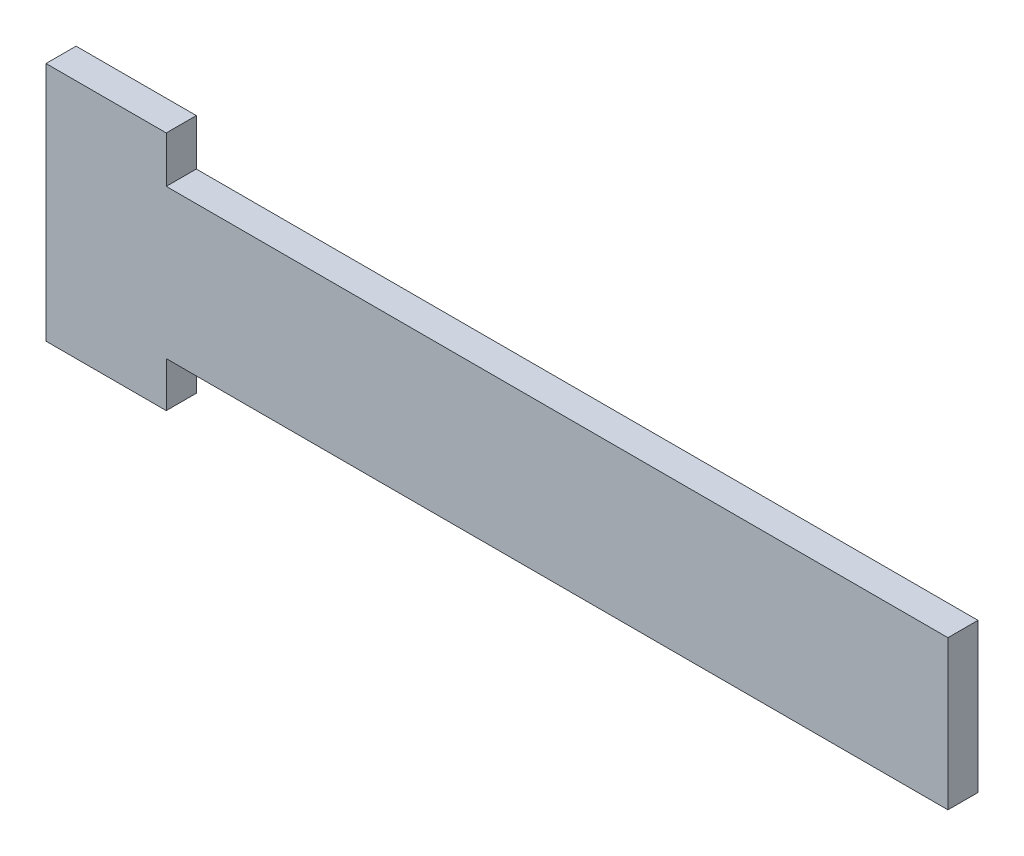
ISO-10303-21;
HEADER;
FILE_DESCRIPTION(('STEP AP214'),'2;1');
FILE_NAME('part.step','',(''),(''),'','','');
FILE_SCHEMA(('AUTOMOTIVE_DESIGN { 1 0 10303 214 1 1 1 1 }'));
ENDSEC;
DATA;
#1=APPLICATION_CONTEXT('core data for automotive mechanical design processes');
#2=APPLICATION_PROTOCOL_DEFINITION('international standard','automotive_design',2000,#1);
#3=PRODUCT_CONTEXT('',#1,'mechanical');
#4=PRODUCT('Part','Part','',(#3));
#5=PRODUCT_RELATED_PRODUCT_CATEGORY('part','',(#4));
#6=PRODUCT_DEFINITION_FORMATION('','',#4);
#7=PRODUCT_DEFINITION_CONTEXT('part definition',#1,'design');
#8=PRODUCT_DEFINITION('design','',#6,#7);
#9=PRODUCT_DEFINITION_SHAPE('','',#8);
#10=(LENGTH_UNIT() NAMED_UNIT(*) SI_UNIT(.MILLI.,.METRE.));
#11=(NAMED_UNIT(*) PLANE_ANGLE_UNIT() SI_UNIT($,.RADIAN.));
#12=(NAMED_UNIT(*) SI_UNIT($,.STERADIAN.) SOLID_ANGLE_UNIT());
#13=UNCERTAINTY_MEASURE_WITH_UNIT(LENGTH_MEASURE(1.E-05),#10,'distance_accuracy_value','');
#14=(GEOMETRIC_REPRESENTATION_CONTEXT(3) GLOBAL_UNCERTAINTY_ASSIGNED_CONTEXT((#13)) GLOBAL_UNIT_ASSIGNED_CONTEXT((#10,
#11,#12)) REPRESENTATION_CONTEXT('',''));
#15=CARTESIAN_POINT('',(0.,0.,0.));
#16=DIRECTION('',(0.,0.,1.));
#17=DIRECTION('',(1.,0.,0.));
#18=AXIS2_PLACEMENT_3D('',#15,#16,#17);
#19=CARTESIAN_POINT('',(-150.,0.,5.));
#20=DIRECTION('',(-1.,0.,0.));
#21=DIRECTION('',(0.,0.,1.));
#22=AXIS2_PLACEMENT_3D('',#19,#20,#21);
#23=PLANE('',#22);
#24=DIRECTION('',(0.,1.,0.));
#25=VECTOR('',#24,1.);
#26=CARTESIAN_POINT('',(-150.,0.,0.));
#27=LINE('',#26,#25);
#28=CARTESIAN_POINT('',(-150.,-7.50000000000002,0.));
#29=VERTEX_POINT('',#28);
#30=CARTESIAN_POINT('',(-150.,32.5,0.));
#31=VERTEX_POINT('',#30);
#32=EDGE_CURVE('E194',#29,#31,#27,.T.);
#33=ORIENTED_EDGE('',*,*,#32,.F.);
#34=DIRECTION('',(0.,0.,-1.));
#35=VECTOR('',#34,1.);
#36=CARTESIAN_POINT('',(-150.,-7.50000000000002,5.));
#37=LINE('',#36,#35);
#38=CARTESIAN_POINT('',(-150.,-7.50000000000002,5.));
#39=VERTEX_POINT('',#38);
#40=EDGE_CURVE('E11',#39,#29,#37,.T.);
#41=ORIENTED_EDGE('',*,*,#40,.F.);
#42=DIRECTION('',(0.,1.,0.));
#43=VECTOR('',#42,1.);
#44=CARTESIAN_POINT('',(-150.,0.,5.));
#45=LINE('',#44,#43);
#46=CARTESIAN_POINT('',(-150.,32.5,5.));
#47=VERTEX_POINT('',#46);
#48=EDGE_CURVE('E150',#39,#47,#45,.T.);
#49=ORIENTED_EDGE('',*,*,#48,.T.);
#50=DIRECTION('',(0.,0.,-1.));
#51=VECTOR('',#50,1.);
#52=CARTESIAN_POINT('',(-150.,32.5,5.));
#53=LINE('',#52,#51);
#54=EDGE_CURVE('E93',#47,#31,#53,.T.);
#55=ORIENTED_EDGE('',*,*,#54,.T.);
#56=EDGE_LOOP('',(#33,#41,#49,#55));
#57=FACE_BOUND('',#56,.T.);
#58=ADVANCED_FACE('F41',(#57),#23,.T.);
#59=CARTESIAN_POINT('',(0.,-7.5,5.));
#60=DIRECTION('',(0.,-1.,0.));
#61=DIRECTION('',(1.,0.,0.));
#62=AXIS2_PLACEMENT_3D('',#59,#60,#61);
#63=PLANE('',#62);
#64=DIRECTION('',(-1.,0.,0.));
#65=VECTOR('',#64,1.);
#66=CARTESIAN_POINT('',(0.,-7.5,0.));
#67=LINE('',#66,#65);
#68=CARTESIAN_POINT('',(-130.,-7.50000000000002,0.));
#69=VERTEX_POINT('',#68);
#70=EDGE_CURVE('E187',#69,#29,#67,.T.);
#71=ORIENTED_EDGE('',*,*,#70,.F.);
#72=DIRECTION('',(0.,0.,-1.));
#73=VECTOR('',#72,1.);
#74=CARTESIAN_POINT('',(-130.,-7.50000000000002,5.));
#75=LINE('',#74,#73);
#76=CARTESIAN_POINT('',(-130.,-7.50000000000002,5.));
#77=VERTEX_POINT('',#76);
#78=EDGE_CURVE('E50',#77,#69,#75,.T.);
#79=ORIENTED_EDGE('',*,*,#78,.F.);
#80=DIRECTION('',(-1.,0.,0.));
#81=VECTOR('',#80,1.);
#82=CARTESIAN_POINT('',(0.,-7.5,5.));
#83=LINE('',#82,#81);
#84=EDGE_CURVE('E142',#77,#39,#83,.T.);
#85=ORIENTED_EDGE('',*,*,#84,.T.);
#86=ORIENTED_EDGE('',*,*,#40,.T.);
#87=EDGE_LOOP('',(#71,#79,#85,#86));
#88=FACE_BOUND('',#87,.T.);
#89=ADVANCED_FACE('F192',(#88),#63,.T.);
#90=CARTESIAN_POINT('',(-130.,0.,5.));
#91=DIRECTION('',(-1.,0.,0.));
#92=DIRECTION('',(0.,0.,1.));
#93=AXIS2_PLACEMENT_3D('',#90,#91,#92);
#94=PLANE('',#93);
#95=DIRECTION('',(0.,1.,0.));
#96=VECTOR('',#95,1.);
#97=CARTESIAN_POINT('',(-130.,0.,0.));
#98=LINE('',#97,#96);
#99=CARTESIAN_POINT('',(-130.,0.,0.));
#100=VERTEX_POINT('',#99);
#101=EDGE_CURVE('E162',#69,#100,#98,.T.);
#102=ORIENTED_EDGE('',*,*,#101,.T.);
#103=DIRECTION('',(0.,0.,-1.));
#104=VECTOR('',#103,1.);
#105=CARTESIAN_POINT('',(-130.,0.,5.));
#106=LINE('',#105,#104);
#107=CARTESIAN_POINT('',(-130.,0.,5.));
#108=VERTEX_POINT('',#107);
#109=EDGE_CURVE('E175',#108,#100,#106,.T.);
#110=ORIENTED_EDGE('',*,*,#109,.F.);
#111=DIRECTION('',(0.,1.,0.));
#112=VECTOR('',#111,1.);
#113=CARTESIAN_POINT('',(-130.,0.,5.));
#114=LINE('',#113,#112);
#115=EDGE_CURVE('E135',#77,#108,#114,.T.);
#116=ORIENTED_EDGE('',*,*,#115,.F.);
#117=ORIENTED_EDGE('',*,*,#78,.T.);
#118=EDGE_LOOP('',(#102,#110,#116,#117));
#119=FACE_BOUND('',#118,.T.);
#120=ADVANCED_FACE('F181',(#119),#94,.F.);
#121=CARTESIAN_POINT('',(0.,0.,5.));
#122=DIRECTION('',(0.,-1.,0.));
#123=DIRECTION('',(1.,0.,0.));
#124=AXIS2_PLACEMENT_3D('',#121,#122,#123);
#125=PLANE('',#124);
#126=DIRECTION('',(-1.,0.,0.));
#127=VECTOR('',#126,1.);
#128=CARTESIAN_POINT('',(0.,0.,0.));
#129=LINE('',#128,#127);
#130=CARTESIAN_POINT('',(0.,0.,0.));
#131=VERTEX_POINT('',#130);
#132=EDGE_CURVE('E190',#131,#100,#129,.T.);
#133=ORIENTED_EDGE('',*,*,#132,.F.);
#134=DIRECTION('',(0.,0.,-1.));
#135=VECTOR('',#134,1.);
#136=CARTESIAN_POINT('',(0.,0.,5.));
#137=LINE('',#136,#135);
#138=CARTESIAN_POINT('',(0.,0.,5.));
#139=VERTEX_POINT('',#138);
#140=EDGE_CURVE('E172',#139,#131,#137,.T.);
#141=ORIENTED_EDGE('',*,*,#140,.F.);
#142=DIRECTION('',(-1.,0.,0.));
#143=VECTOR('',#142,1.);
#144=CARTESIAN_POINT('',(0.,0.,5.));
#145=LINE('',#144,#143);
#146=EDGE_CURVE('E141',#139,#108,#145,.T.);
#147=ORIENTED_EDGE('',*,*,#146,.T.);
#148=ORIENTED_EDGE('',*,*,#109,.T.);
#149=EDGE_LOOP('',(#133,#141,#147,#148));
#150=FACE_BOUND('',#149,.T.);
#151=ADVANCED_FACE('F212',(#150),#125,.T.);
#152=CARTESIAN_POINT('',(0.,0.,5.));
#153=DIRECTION('',(-1.,0.,0.));
#154=DIRECTION('',(0.,0.,1.));
#155=AXIS2_PLACEMENT_3D('',#152,#153,#154);
#156=PLANE('',#155);
#157=DIRECTION('',(0.,1.,0.));
#158=VECTOR('',#157,1.);
#159=CARTESIAN_POINT('',(0.,0.,0.));
#160=LINE('',#159,#158);
#161=CARTESIAN_POINT('',(0.,24.8,0.));
#162=VERTEX_POINT('',#161);
#163=EDGE_CURVE('E200',#131,#162,#160,.T.);
#164=ORIENTED_EDGE('',*,*,#163,.T.);
#165=DIRECTION('',(0.,0.,-1.));
#166=VECTOR('',#165,1.);
#167=CARTESIAN_POINT('',(0.,24.8,5.));
#168=LINE('',#167,#166);
#169=CARTESIAN_POINT('',(0.,24.8,5.));
#170=VERTEX_POINT('',#169);
#171=EDGE_CURVE('E129',#170,#162,#168,.T.);
#172=ORIENTED_EDGE('',*,*,#171,.F.);
#173=DIRECTION('',(0.,1.,0.));
#174=VECTOR('',#173,1.);
#175=CARTESIAN_POINT('',(0.,0.,5.));
#176=LINE('',#175,#174);
#177=EDGE_CURVE('E118',#139,#170,#176,.T.);
#178=ORIENTED_EDGE('',*,*,#177,.F.);
#179=ORIENTED_EDGE('',*,*,#140,.T.);
#180=EDGE_LOOP('',(#164,#172,#178,#179));
#181=FACE_BOUND('',#180,.T.);
#182=ADVANCED_FACE('F204',(#181),#156,.F.);
#183=CARTESIAN_POINT('',(0.,24.8,5.));
#184=DIRECTION('',(0.,-1.,0.));
#185=DIRECTION('',(1.,0.,0.));
#186=AXIS2_PLACEMENT_3D('',#183,#184,#185);
#187=PLANE('',#186);
#188=DIRECTION('',(-1.,0.,0.));
#189=VECTOR('',#188,1.);
#190=CARTESIAN_POINT('',(0.,24.8,0.));
#191=LINE('',#190,#189);
#192=CARTESIAN_POINT('',(-130.,24.8,0.));
#193=VERTEX_POINT('',#192);
#194=EDGE_CURVE('E127',#162,#193,#191,.T.);
#195=ORIENTED_EDGE('',*,*,#194,.T.);
#196=DIRECTION('',(0.,0.,-1.));
#197=VECTOR('',#196,1.);
#198=CARTESIAN_POINT('',(-130.,24.8,5.));
#199=LINE('',#198,#197);
#200=CARTESIAN_POINT('',(-130.,24.8,5.));
#201=VERTEX_POINT('',#200);
#202=EDGE_CURVE('E124',#201,#193,#199,.T.);
#203=ORIENTED_EDGE('',*,*,#202,.F.);
#204=DIRECTION('',(-1.,0.,0.));
#205=VECTOR('',#204,1.);
#206=CARTESIAN_POINT('',(0.,24.8,5.));
#207=LINE('',#206,#205);
#208=EDGE_CURVE('E111',#170,#201,#207,.T.);
#209=ORIENTED_EDGE('',*,*,#208,.F.);
#210=ORIENTED_EDGE('',*,*,#171,.T.);
#211=EDGE_LOOP('',(#195,#203,#209,#210));
#212=FACE_BOUND('',#211,.T.);
#213=ADVANCED_FACE('F125',(#212),#187,.F.);
#214=CARTESIAN_POINT('',(-130.,32.5,0.));
#215=VERTEX_POINT('',#214);
#216=EDGE_CURVE('E86',#193,#215,#98,.T.);
#217=ORIENTED_EDGE('',*,*,#216,.T.);
#218=DIRECTION('',(0.,0.,-1.));
#219=VECTOR('',#218,1.);
#220=CARTESIAN_POINT('',(-130.,32.5,5.));
#221=LINE('',#220,#219);
#222=CARTESIAN_POINT('',(-130.,32.5,5.));
#223=VERTEX_POINT('',#222);
#224=EDGE_CURVE('E130',#223,#215,#221,.T.);
#225=ORIENTED_EDGE('',*,*,#224,.F.);
#226=EDGE_CURVE('E115',#201,#223,#114,.T.);
#227=ORIENTED_EDGE('',*,*,#226,.F.);
#228=ORIENTED_EDGE('',*,*,#202,.T.);
#229=EDGE_LOOP('',(#217,#225,#227,#228));
#230=FACE_BOUND('',#229,.T.);
#231=ADVANCED_FACE('F132',(#230),#94,.F.);
#232=CARTESIAN_POINT('',(0.,32.5,5.));
#233=DIRECTION('',(0.,-1.,0.));
#234=DIRECTION('',(0.,0.,-1.));
#235=AXIS2_PLACEMENT_3D('',#232,#233,#234);
#236=PLANE('',#235);
#237=DIRECTION('',(-1.,0.,0.));
#238=VECTOR('',#237,1.);
#239=CARTESIAN_POINT('',(0.,32.5,0.));
#240=LINE('',#239,#238);
#241=EDGE_CURVE('E153',#215,#31,#240,.T.);
#242=ORIENTED_EDGE('',*,*,#241,.T.);
#243=ORIENTED_EDGE('',*,*,#54,.F.);
#244=DIRECTION('',(-1.,0.,0.));
#245=VECTOR('',#244,1.);
#246=CARTESIAN_POINT('',(0.,32.5,5.));
#247=LINE('',#246,#245);
#248=EDGE_CURVE('E58',#223,#47,#247,.T.);
#249=ORIENTED_EDGE('',*,*,#248,.F.);
#250=ORIENTED_EDGE('',*,*,#224,.T.);
#251=EDGE_LOOP('',(#242,#243,#249,#250));
#252=FACE_BOUND('',#251,.T.);
#253=ADVANCED_FACE('F223',(#252),#236,.F.);
#254=CARTESIAN_POINT('',(0.,0.,5.));
#255=DIRECTION('',(0.,0.,1.));
#256=DIRECTION('',(1.,0.,0.));
#257=AXIS2_PLACEMENT_3D('',#254,#255,#256);
#258=PLANE('',#257);
#259=ORIENTED_EDGE('',*,*,#48,.F.);
#260=ORIENTED_EDGE('',*,*,#84,.F.);
#261=ORIENTED_EDGE('',*,*,#115,.T.);
#262=ORIENTED_EDGE('',*,*,#146,.F.);
#263=ORIENTED_EDGE('',*,*,#177,.T.);
#264=ORIENTED_EDGE('',*,*,#208,.T.);
#265=ORIENTED_EDGE('',*,*,#226,.T.);
#266=ORIENTED_EDGE('',*,*,#248,.T.);
#267=EDGE_LOOP('',(#259,#260,#261,#262,#263,#264,#265,#266));
#268=FACE_BOUND('',#267,.T.);
#269=ADVANCED_FACE('F113',(#268),#258,.T.);
#270=CARTESIAN_POINT('',(0.,0.,0.));
#271=DIRECTION('',(0.,0.,1.));
#272=DIRECTION('',(1.,0.,0.));
#273=AXIS2_PLACEMENT_3D('',#270,#271,#272);
#274=PLANE('',#273);
#275=ORIENTED_EDGE('',*,*,#32,.T.);
#276=ORIENTED_EDGE('',*,*,#241,.F.);
#277=ORIENTED_EDGE('',*,*,#216,.F.);
#278=ORIENTED_EDGE('',*,*,#194,.F.);
#279=ORIENTED_EDGE('',*,*,#163,.F.);
#280=ORIENTED_EDGE('',*,*,#132,.T.);
#281=ORIENTED_EDGE('',*,*,#101,.F.);
#282=ORIENTED_EDGE('',*,*,#70,.T.);
#283=EDGE_LOOP('',(#275,#276,#277,#278,#279,#280,#281,#282));
#284=FACE_BOUND('',#283,.T.);
#285=ADVANCED_FACE('F186',(#284),#274,.F.);
#286=CLOSED_SHELL('',(#58,#89,#120,#151,#182,#213,#231,#253,#269,#285));
#287=MANIFOLD_SOLID_BREP('B2',#286);
#288=ADVANCED_BREP_SHAPE_REPRESENTATION('',(#18,#287),#14);
#289=SHAPE_DEFINITION_REPRESENTATION(#9,#288);
ENDSEC;
END-ISO-10303-21;
